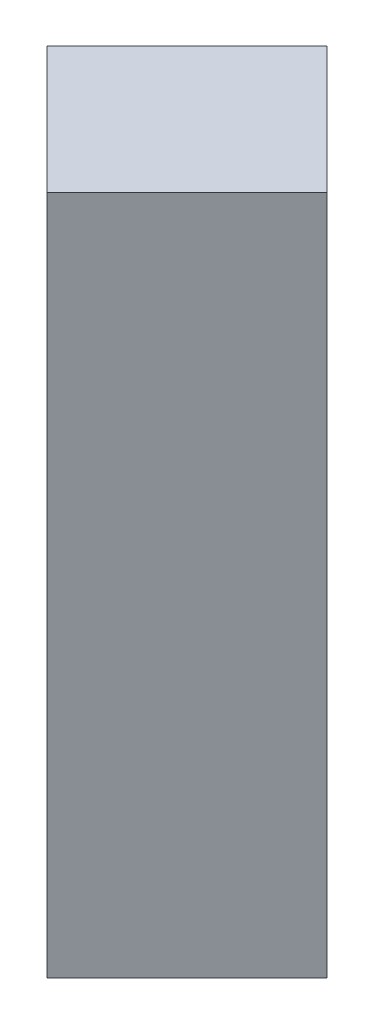
ISO-10303-21;
HEADER;
FILE_DESCRIPTION(('STEP AP214'),'2;1');
FILE_NAME('part.step','',(''),(''),'','','');
FILE_SCHEMA(('AUTOMOTIVE_DESIGN { 1 0 10303 214 1 1 1 1 }'));
ENDSEC;
DATA;
#1=APPLICATION_CONTEXT('core data for automotive mechanical design processes');
#2=APPLICATION_PROTOCOL_DEFINITION('international standard','automotive_design',2000,#1);
#3=PRODUCT_CONTEXT('',#1,'mechanical');
#4=PRODUCT('Part','Part','',(#3));
#5=PRODUCT_RELATED_PRODUCT_CATEGORY('part','',(#4));
#6=PRODUCT_DEFINITION_FORMATION('','',#4);
#7=PRODUCT_DEFINITION_CONTEXT('part definition',#1,'design');
#8=PRODUCT_DEFINITION('design','',#6,#7);
#9=PRODUCT_DEFINITION_SHAPE('','',#8);
#10=(LENGTH_UNIT() NAMED_UNIT(*) SI_UNIT(.MILLI.,.METRE.));
#11=(NAMED_UNIT(*) PLANE_ANGLE_UNIT() SI_UNIT($,.RADIAN.));
#12=(NAMED_UNIT(*) SI_UNIT($,.STERADIAN.) SOLID_ANGLE_UNIT());
#13=UNCERTAINTY_MEASURE_WITH_UNIT(LENGTH_MEASURE(1.E-05),#10,'distance_accuracy_value','');
#14=(GEOMETRIC_REPRESENTATION_CONTEXT(3) GLOBAL_UNCERTAINTY_ASSIGNED_CONTEXT((#13)) GLOBAL_UNIT_ASSIGNED_CONTEXT((#10,
#11,#12)) REPRESENTATION_CONTEXT('',''));
#15=CARTESIAN_POINT('',(0.,0.,0.));
#16=DIRECTION('',(0.,0.,1.));
#17=DIRECTION('',(1.,0.,0.));
#18=AXIS2_PLACEMENT_3D('',#15,#16,#17);
#19=CARTESIAN_POINT('',(97.5788751746,41.8789091554,98.024621832));
#20=DIRECTION('',(0.707106790876862,0.,-0.707106771496233));
#21=DIRECTION('',(-0.707106771496233,0.,-0.707106790876862));
#22=AXIS2_PLACEMENT_3D('',#19,#20,#21);
#23=PLANE('',#22);
#24=DIRECTION('',(0.707106771496233,0.,0.707106790876862));
#25=VECTOR('',#24,1.);
#26=CARTESIAN_POINT('',(97.1155126901,46.8419278552,97.5612593348));
#27=LINE('',#26,#25);
#28=CARTESIAN_POINT('',(96.6521502056,46.8419278552,97.0978968376));
#29=VERTEX_POINT('',#28);
#30=CARTESIAN_POINT('',(97.5788751746,46.8419278552,98.024621832));
#31=VERTEX_POINT('',#30);
#32=EDGE_CURVE('E61',#29,#31,#27,.T.);
#33=ORIENTED_EDGE('',*,*,#32,.T.);
#34=DIRECTION('',(0.,1.,0.));
#35=VECTOR('',#34,1.);
#36=CARTESIAN_POINT('',(97.5788751746,44.3604185053,98.024621832));
#37=LINE('',#36,#35);
#38=CARTESIAN_POINT('',(97.578875179155,41.8789091554,98.0246218303728));
#39=VERTEX_POINT('',#38);
#40=EDGE_CURVE('E81',#39,#31,#37,.T.);
#41=ORIENTED_EDGE('',*,*,#40,.F.);
#42=DIRECTION('',(-0.707106771496233,0.,-0.707106790876862));
#43=VECTOR('',#42,1.);
#44=CARTESIAN_POINT('',(97.1155126901,41.8789091554,97.5612593348));
#45=LINE('',#44,#43);
#46=CARTESIAN_POINT('',(96.6521502004869,41.8789091554,97.0978968456697));
#47=VERTEX_POINT('',#46);
#48=EDGE_CURVE('E84',#39,#47,#45,.T.);
#49=ORIENTED_EDGE('',*,*,#48,.T.);
#50=DIRECTION('',(0.,-1.,0.));
#51=VECTOR('',#50,1.);
#52=CARTESIAN_POINT('',(96.6521502056,44.3604185053,97.0978968376));
#53=LINE('',#52,#51);
#54=EDGE_CURVE('E65',#29,#47,#53,.T.);
#55=ORIENTED_EDGE('',*,*,#54,.F.);
#56=EDGE_LOOP('',(#33,#41,#49,#55));
#57=FACE_BOUND('',#56,.T.);
#58=ADVANCED_FACE('F17',(#57),#23,.T.);
#59=CARTESIAN_POINT('',(96.5568165126,41.8789091554,99.046680494));
#60=DIRECTION('',(0.707106781186543,0.,0.707106781186552));
#61=DIRECTION('',(0.707106781186552,0.,-0.707106781186543));
#62=AXIS2_PLACEMENT_3D('',#59,#60,#61);
#63=PLANE('',#62);
#64=DIRECTION('',(-0.707106781186552,0.,0.707106781186543));
#65=VECTOR('',#64,1.);
#66=CARTESIAN_POINT('',(97.0678458436,46.8419278552,98.535651163));
#67=LINE('',#66,#65);
#68=CARTESIAN_POINT('',(96.5568165126,46.8419278552,99.046680494));
#69=VERTEX_POINT('',#68);
#70=EDGE_CURVE('E78',#31,#69,#67,.T.);
#71=ORIENTED_EDGE('',*,*,#70,.T.);
#72=DIRECTION('',(0.,1.,0.));
#73=VECTOR('',#72,1.);
#74=CARTESIAN_POINT('',(96.5568165126,44.3604185053,99.046680494));
#75=LINE('',#74,#73);
#76=CARTESIAN_POINT('',(96.5568165188428,41.8789091554,99.0466804877572));
#77=VERTEX_POINT('',#76);
#78=EDGE_CURVE('E73',#77,#69,#75,.T.);
#79=ORIENTED_EDGE('',*,*,#78,.F.);
#80=DIRECTION('',(0.707106781186552,0.,-0.707106781186543));
#81=VECTOR('',#80,1.);
#82=CARTESIAN_POINT('',(97.0678458436,41.8789091554,98.535651163));
#83=LINE('',#82,#81);
#84=EDGE_CURVE('E31',#77,#39,#83,.T.);
#85=ORIENTED_EDGE('',*,*,#84,.T.);
#86=ORIENTED_EDGE('',*,*,#40,.T.);
#87=EDGE_LOOP('',(#71,#79,#85,#86));
#88=FACE_BOUND('',#87,.T.);
#89=ADVANCED_FACE('F89',(#88),#63,.T.);
#90=CARTESIAN_POINT('',(96.6521502056,46.8419278552,97.0978968376));
#91=DIRECTION('',(0.,-1.,0.));
#92=DIRECTION('',(0.707106771496233,0.,0.707106790876862));
#93=AXIS2_PLACEMENT_3D('',#90,#91,#92);
#94=PLANE('',#93);
#95=ORIENTED_EDGE('',*,*,#32,.F.);
#96=DIRECTION('',(0.707106781186543,0.,-0.707106781186552));
#97=VECTOR('',#96,1.);
#98=CARTESIAN_POINT('',(96.1411208746,46.8419278552,97.6089261686));
#99=LINE('',#98,#97);
#100=CARTESIAN_POINT('',(95.6300915436,46.8419278552,98.1199554996));
#101=VERTEX_POINT('',#100);
#102=EDGE_CURVE('E54',#101,#29,#99,.T.);
#103=ORIENTED_EDGE('',*,*,#102,.F.);
#104=DIRECTION('',(-0.707106771496233,0.,-0.707106790876862));
#105=VECTOR('',#104,1.);
#106=CARTESIAN_POINT('',(96.0934540281,46.8419278552,98.5833179968));
#107=LINE('',#106,#105);
#108=EDGE_CURVE('E59',#69,#101,#107,.T.);
#109=ORIENTED_EDGE('',*,*,#108,.F.);
#110=ORIENTED_EDGE('',*,*,#70,.F.);
#111=EDGE_LOOP('',(#95,#103,#109,#110));
#112=FACE_BOUND('',#111,.T.);
#113=ADVANCED_FACE('F56',(#112),#94,.F.);
#114=CARTESIAN_POINT('',(96.6521502056,41.8789091554,97.0978968376));
#115=DIRECTION('',(-0.707106781186552,0.,-0.707106781186543));
#116=DIRECTION('',(-0.707106781186543,0.,0.707106781186552));
#117=AXIS2_PLACEMENT_3D('',#114,#115,#116);
#118=PLANE('',#117);
#119=ORIENTED_EDGE('',*,*,#102,.T.);
#120=ORIENTED_EDGE('',*,*,#54,.T.);
#121=DIRECTION('',(-0.707106781186543,0.,0.707106781186552));
#122=VECTOR('',#121,1.);
#123=CARTESIAN_POINT('',(96.1411208746,41.8789091554,97.6089261686));
#124=LINE('',#123,#122);
#125=CARTESIAN_POINT('',(95.6300915405089,41.8789091554,98.1199555026911));
#126=VERTEX_POINT('',#125);
#127=EDGE_CURVE('E66',#47,#126,#124,.T.);
#128=ORIENTED_EDGE('',*,*,#127,.T.);
#129=DIRECTION('',(0.,-1.,0.));
#130=VECTOR('',#129,1.);
#131=CARTESIAN_POINT('',(95.6300915436,44.3604185053,98.1199554996));
#132=LINE('',#131,#130);
#133=EDGE_CURVE('E26',#101,#126,#132,.T.);
#134=ORIENTED_EDGE('',*,*,#133,.F.);
#135=EDGE_LOOP('',(#119,#120,#128,#134));
#136=FACE_BOUND('',#135,.T.);
#137=ADVANCED_FACE('F69',(#136),#118,.T.);
#138=CARTESIAN_POINT('',(95.6300915436,41.8789091554,98.1199554996));
#139=DIRECTION('',(-0.707106790876862,0.,0.707106771496233));
#140=DIRECTION('',(0.707106771496233,0.,0.707106790876862));
#141=AXIS2_PLACEMENT_3D('',#138,#139,#140);
#142=PLANE('',#141);
#143=ORIENTED_EDGE('',*,*,#108,.T.);
#144=ORIENTED_EDGE('',*,*,#133,.T.);
#145=DIRECTION('',(-0.707106785740034,0.,-0.707106776633061));
#146=VECTOR('',#145,1.);
#147=CARTESIAN_POINT('',(96.5568165221289,41.8789091554,99.0466804785578));
#148=LINE('',#147,#146);
#149=EDGE_CURVE('E11',#77,#126,#148,.T.);
#150=ORIENTED_EDGE('',*,*,#149,.F.);
#151=ORIENTED_EDGE('',*,*,#78,.T.);
#152=EDGE_LOOP('',(#143,#144,#150,#151));
#153=FACE_BOUND('',#152,.T.);
#154=ADVANCED_FACE('F72',(#153),#142,.T.);
#155=CARTESIAN_POINT('',(95.6183988314,41.8789091554,99.0583731808));
#156=DIRECTION('',(0.,-1.,0.));
#157=DIRECTION('',(0.,0.,-1.));
#158=AXIS2_PLACEMENT_3D('',#155,#156,#157);
#159=PLANE('',#158);
#160=ORIENTED_EDGE('',*,*,#84,.F.);
#161=ORIENTED_EDGE('',*,*,#149,.T.);
#162=ORIENTED_EDGE('',*,*,#127,.F.);
#163=ORIENTED_EDGE('',*,*,#48,.F.);
#164=EDGE_LOOP('',(#160,#161,#162,#163));
#165=FACE_BOUND('',#164,.T.);
#166=ADVANCED_FACE('F19',(#165),#159,.T.);
#167=CLOSED_SHELL('',(#58,#89,#113,#137,#154,#166));
#168=MANIFOLD_SOLID_BREP('B1',#167);
#169=ADVANCED_BREP_SHAPE_REPRESENTATION('',(#18,#168),#14);
#170=SHAPE_DEFINITION_REPRESENTATION(#9,#169);
ENDSEC;
END-ISO-10303-21;
